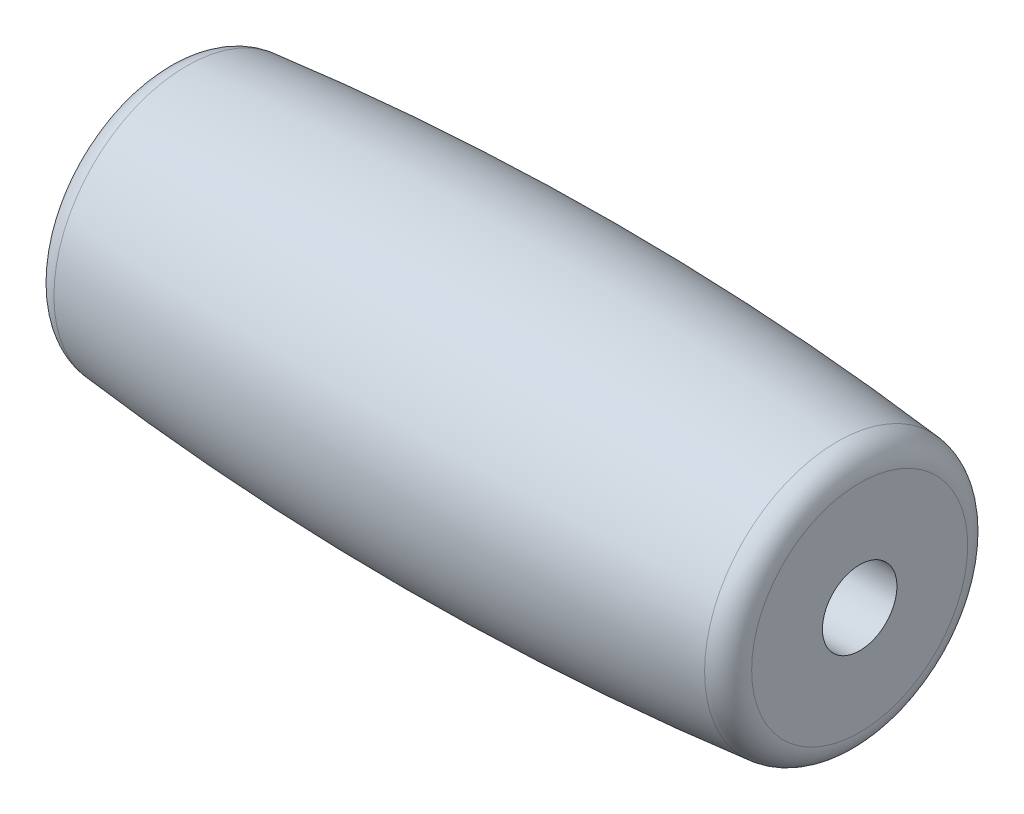
ISO-10303-21;
HEADER;
FILE_DESCRIPTION(('STEP AP214'),'2;1');
FILE_NAME('part.step','',(''),(''),'','','');
FILE_SCHEMA(('AUTOMOTIVE_DESIGN { 1 0 10303 214 1 1 1 1 }'));
ENDSEC;
DATA;
#1=APPLICATION_CONTEXT('core data for automotive mechanical design processes');
#2=APPLICATION_PROTOCOL_DEFINITION('international standard','automotive_design',2000,#1);
#3=PRODUCT_CONTEXT('',#1,'mechanical');
#4=PRODUCT('Part','Part','',(#3));
#5=PRODUCT_RELATED_PRODUCT_CATEGORY('part','',(#4));
#6=PRODUCT_DEFINITION_FORMATION('','',#4);
#7=PRODUCT_DEFINITION_CONTEXT('part definition',#1,'design');
#8=PRODUCT_DEFINITION('design','',#6,#7);
#9=PRODUCT_DEFINITION_SHAPE('','',#8);
#10=(LENGTH_UNIT() NAMED_UNIT(*) SI_UNIT(.MILLI.,.METRE.));
#11=(NAMED_UNIT(*) PLANE_ANGLE_UNIT() SI_UNIT($,.RADIAN.));
#12=(NAMED_UNIT(*) SI_UNIT($,.STERADIAN.) SOLID_ANGLE_UNIT());
#13=UNCERTAINTY_MEASURE_WITH_UNIT(LENGTH_MEASURE(1.E-05),#10,'distance_accuracy_value','');
#14=(GEOMETRIC_REPRESENTATION_CONTEXT(3) GLOBAL_UNCERTAINTY_ASSIGNED_CONTEXT((#13)) GLOBAL_UNIT_ASSIGNED_CONTEXT((#10,
#11,#12)) REPRESENTATION_CONTEXT('',''));
#15=CARTESIAN_POINT('',(0.,0.,0.));
#16=DIRECTION('',(0.,0.,1.));
#17=DIRECTION('',(1.,0.,0.));
#18=AXIS2_PLACEMENT_3D('',#15,#16,#17);
#19=CARTESIAN_POINT('',(13.9999999998325,4.35,0.));
#20=DIRECTION('',(-1.,0.,0.));
#21=DIRECTION('',(0.,0.,1.));
#22=AXIS2_PLACEMENT_3D('',#19,#20,#21);
#23=PLANE('',#22);
#24=CARTESIAN_POINT('',(13.9999999998325,0.,0.));
#25=DIRECTION('',(-1.,0.,0.));
#26=DIRECTION('',(0.,0.,1.));
#27=AXIS2_PLACEMENT_3D('',#24,#25,#26);
#28=CIRCLE('',#27,4.35);
#29=CARTESIAN_POINT('',(13.9999999998325,0.,4.35));
#30=VERTEX_POINT('',#29);
#31=EDGE_CURVE('E54',#30,#30,#28,.T.);
#32=ORIENTED_EDGE('',*,*,#31,.F.);
#33=EDGE_LOOP('',(#32));
#34=FACE_BOUND('',#33,.T.);
#35=CARTESIAN_POINT('',(13.9999999998325,0.,0.));
#36=DIRECTION('',(-1.,0.,0.));
#37=DIRECTION('',(0.,0.,1.));
#38=AXIS2_PLACEMENT_3D('',#35,#36,#37);
#39=CIRCLE('',#38,1.5);
#40=CARTESIAN_POINT('',(13.9999999998325,0.,1.5));
#41=VERTEX_POINT('',#40);
#42=EDGE_CURVE('E10',#41,#41,#39,.T.);
#43=ORIENTED_EDGE('',*,*,#42,.T.);
#44=EDGE_LOOP('',(#43));
#45=FACE_BOUND('',#44,.T.);
#46=ADVANCED_FACE('F32',(#34,#45),#23,.F.);
#47=CARTESIAN_POINT('',(0.,0.,0.));
#48=DIRECTION('',(-1.,0.,0.));
#49=DIRECTION('',(0.,0.,1.));
#50=AXIS2_PLACEMENT_3D('',#47,#48,#49);
#51=CYLINDRICAL_SURFACE('',#50,1.5);
#52=ORIENTED_EDGE('',*,*,#42,.F.);
#53=EDGE_LOOP('',(#52));
#54=FACE_BOUND('',#53,.T.);
#55=CARTESIAN_POINT('',(-13.9999999998325,0.,0.));
#56=DIRECTION('',(-1.,0.,0.));
#57=DIRECTION('',(0.,0.,1.));
#58=AXIS2_PLACEMENT_3D('',#55,#56,#57);
#59=CIRCLE('',#58,1.5);
#60=CARTESIAN_POINT('',(-13.9999999998325,0.,1.5));
#61=VERTEX_POINT('',#60);
#62=EDGE_CURVE('E38',#61,#61,#59,.T.);
#63=ORIENTED_EDGE('',*,*,#62,.T.);
#64=EDGE_LOOP('',(#63));
#65=FACE_BOUND('',#64,.T.);
#66=ADVANCED_FACE('F61',(#54,#65),#51,.F.);
#67=CARTESIAN_POINT('',(-13.9999999998325,4.34857666508195,0.));
#68=DIRECTION('',(1.,0.,0.));
#69=DIRECTION('',(0.,0.,-1.));
#70=AXIS2_PLACEMENT_3D('',#67,#68,#69);
#71=PLANE('',#70);
#72=ORIENTED_EDGE('',*,*,#62,.F.);
#73=EDGE_LOOP('',(#72));
#74=FACE_BOUND('',#73,.T.);
#75=CARTESIAN_POINT('',(-13.9999999998325,0.,0.));
#76=DIRECTION('',(-1.,0.,0.));
#77=DIRECTION('',(0.,0.,1.));
#78=AXIS2_PLACEMENT_3D('',#75,#76,#77);
#79=CIRCLE('',#78,4.34857666508195);
#80=CARTESIAN_POINT('',(-13.9999999998325,0.,4.34857666508195));
#81=VERTEX_POINT('',#80);
#82=EDGE_CURVE('E42',#81,#81,#79,.T.);
#83=ORIENTED_EDGE('',*,*,#82,.T.);
#84=EDGE_LOOP('',(#83));
#85=FACE_BOUND('',#84,.T.);
#86=ADVANCED_FACE('F65',(#74,#85),#71,.F.);
#87=CARTESIAN_POINT('',(-12.9999999998325,0.,0.));
#88=DIRECTION('',(-1.,0.,0.));
#89=DIRECTION('',(0.,0.,1.));
#90=AXIS2_PLACEMENT_3D('',#87,#88,#89);
#91=TOROIDAL_SURFACE('',#90,4.34857666508195,1.00000000000001);
#92=ORIENTED_EDGE('',*,*,#82,.F.);
#93=EDGE_LOOP('',(#92));
#94=FACE_BOUND('',#93,.T.);
#95=CARTESIAN_POINT('',(-13.0999137612862,0.,0.));
#96=DIRECTION('',(-1.,0.,0.));
#97=DIRECTION('',(0.,0.,1.));
#98=AXIS2_PLACEMENT_3D('',#95,#96,#97);
#99=CIRCLE('',#98,5.3435727657136);
#100=CARTESIAN_POINT('',(-13.0999137612862,0.,5.3435727657136));
#101=VERTEX_POINT('',#100);
#102=EDGE_CURVE('E46',#101,#101,#99,.T.);
#103=ORIENTED_EDGE('',*,*,#102,.T.);
#104=EDGE_LOOP('',(#103));
#105=FACE_BOUND('',#104,.T.);
#106=ADVANCED_FACE('F70',(#94,#105),#91,.T.);
#107=CARTESIAN_POINT('',(0.00709108012828755,0.,0.));
#108=DIRECTION('',(-1.,0.,0.));
#109=DIRECTION('',(0.,0.,1.));
#110=AXIS2_PLACEMENT_3D('',#107,#108,#109);
#111=DEGENERATE_TOROIDAL_SURFACE('',#110,125.183178688939,131.183178880592,.F.);
#112=ORIENTED_EDGE('',*,*,#102,.F.);
#113=EDGE_LOOP('',(#112));
#114=FACE_BOUND('',#113,.T.);
#115=CARTESIAN_POINT('',(13.0998048212498,0.,0.));
#116=DIRECTION('',(-1.,0.,0.));
#117=DIRECTION('',(0.,0.,1.));
#118=AXIS2_PLACEMENT_3D('',#115,#116,#117);
#119=CIRCLE('',#118,5.34500703395599);
#120=CARTESIAN_POINT('',(13.0998048212498,0.,5.34500703395599));
#121=VERTEX_POINT('',#120);
#122=EDGE_CURVE('E51',#121,#121,#119,.T.);
#123=ORIENTED_EDGE('',*,*,#122,.T.);
#124=EDGE_LOOP('',(#123));
#125=FACE_BOUND('',#124,.T.);
#126=ADVANCED_FACE('F76',(#114,#125),#111,.F.);
#127=CARTESIAN_POINT('',(12.9999999998325,0.,0.));
#128=DIRECTION('',(-1.,0.,0.));
#129=DIRECTION('',(0.,0.,1.));
#130=AXIS2_PLACEMENT_3D('',#127,#128,#129);
#131=TOROIDAL_SURFACE('',#130,4.35,1.00000000000001);
#132=ORIENTED_EDGE('',*,*,#122,.F.);
#133=EDGE_LOOP('',(#132));
#134=FACE_BOUND('',#133,.T.);
#135=ORIENTED_EDGE('',*,*,#31,.T.);
#136=EDGE_LOOP('',(#135));
#137=FACE_BOUND('',#136,.T.);
#138=ADVANCED_FACE('F58',(#134,#137),#131,.T.);
#139=CLOSED_SHELL('',(#46,#66,#86,#106,#126,#138));
#140=MANIFOLD_SOLID_BREP('B2',#139);
#141=ADVANCED_BREP_SHAPE_REPRESENTATION('',(#18,#140),#14);
#142=SHAPE_DEFINITION_REPRESENTATION(#9,#141);
ENDSEC;
END-ISO-10303-21;
